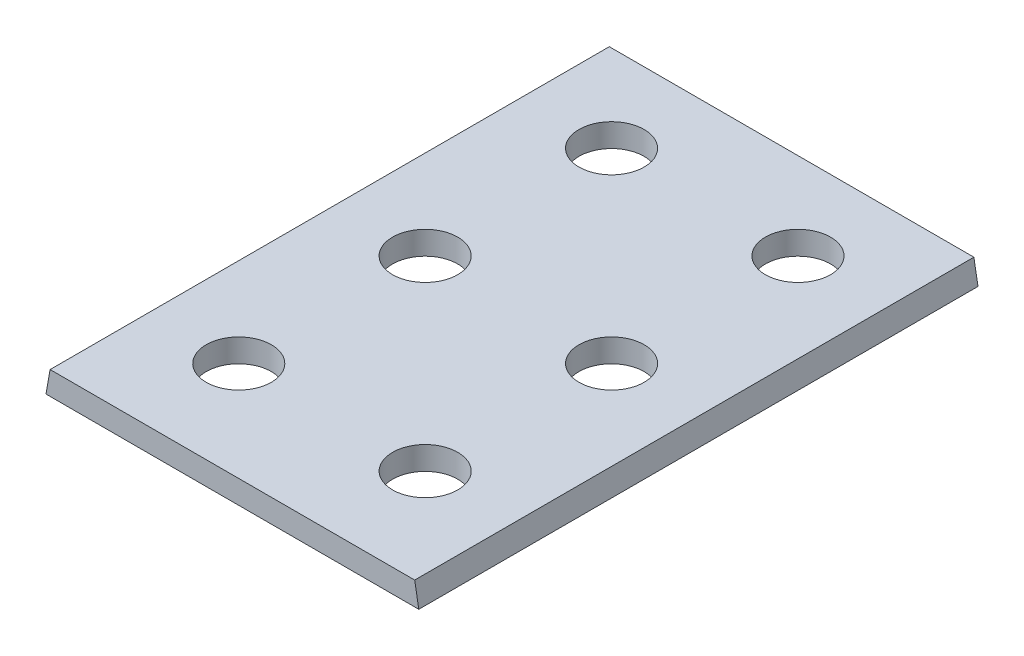
ISO-10303-21;
HEADER;
FILE_DESCRIPTION(('STEP AP214'),'2;1');
FILE_NAME('part.step','',(''),(''),'','','');
FILE_SCHEMA(('AUTOMOTIVE_DESIGN { 1 0 10303 214 1 1 1 1 }'));
ENDSEC;
DATA;
#1=APPLICATION_CONTEXT('core data for automotive mechanical design processes');
#2=APPLICATION_PROTOCOL_DEFINITION('international standard','automotive_design',2000,#1);
#3=PRODUCT_CONTEXT('',#1,'mechanical');
#4=PRODUCT('Part','Part','',(#3));
#5=PRODUCT_RELATED_PRODUCT_CATEGORY('part','',(#4));
#6=PRODUCT_DEFINITION_FORMATION('','',#4);
#7=PRODUCT_DEFINITION_CONTEXT('part definition',#1,'design');
#8=PRODUCT_DEFINITION('design','',#6,#7);
#9=PRODUCT_DEFINITION_SHAPE('','',#8);
#10=(LENGTH_UNIT() NAMED_UNIT(*) SI_UNIT(.MILLI.,.METRE.));
#11=(NAMED_UNIT(*) PLANE_ANGLE_UNIT() SI_UNIT($,.RADIAN.));
#12=(NAMED_UNIT(*) SI_UNIT($,.STERADIAN.) SOLID_ANGLE_UNIT());
#13=UNCERTAINTY_MEASURE_WITH_UNIT(LENGTH_MEASURE(1.E-05),#10,'distance_accuracy_value','');
#14=(GEOMETRIC_REPRESENTATION_CONTEXT(3) GLOBAL_UNCERTAINTY_ASSIGNED_CONTEXT((#13)) GLOBAL_UNIT_ASSIGNED_CONTEXT((#10,
#11,#12)) REPRESENTATION_CONTEXT('',''));
#15=CARTESIAN_POINT('',(0.,0.,0.));
#16=DIRECTION('',(0.,0.,1.));
#17=DIRECTION('',(1.,0.,0.));
#18=AXIS2_PLACEMENT_3D('',#15,#16,#17);
#19=CARTESIAN_POINT('',(0.,6.75,0.));
#20=DIRECTION('',(0.,1.,0.));
#21=DIRECTION('',(0.,0.,1.));
#22=AXIS2_PLACEMENT_3D('',#19,#20,#21);
#23=PLANE('',#22);
#24=CARTESIAN_POINT('',(26.9999999999998,6.75,79.1561495890742));
#25=DIRECTION('',(0.,1.,0.));
#26=DIRECTION('',(0.,0.,1.));
#27=AXIS2_PLACEMENT_3D('',#24,#25,#26);
#28=CIRCLE('',#27,9.43814497246696);
#29=CARTESIAN_POINT('',(26.9999999999998,6.75,88.5942945615411));
#30=VERTEX_POINT('',#29);
#31=EDGE_CURVE('E129',#30,#30,#28,.T.);
#32=ORIENTED_EDGE('',*,*,#31,.F.);
#33=EDGE_LOOP('',(#32));
#34=FACE_BOUND('',#33,.T.);
#35=CARTESIAN_POINT('',(80.9999999999998,6.75,79.1561495890742));
#36=DIRECTION('',(0.,1.,0.));
#37=DIRECTION('',(0.,0.,1.));
#38=AXIS2_PLACEMENT_3D('',#35,#36,#37);
#39=CIRCLE('',#38,9.43814497246697);
#40=CARTESIAN_POINT('',(80.9999999999998,6.75,88.5942945615411));
#41=VERTEX_POINT('',#40);
#42=EDGE_CURVE('E117',#41,#41,#39,.T.);
#43=ORIENTED_EDGE('',*,*,#42,.F.);
#44=EDGE_LOOP('',(#43));
#45=FACE_BOUND('',#44,.T.);
#46=CARTESIAN_POINT('',(27.,6.75,133.156149589074));
#47=DIRECTION('',(0.,1.,0.));
#48=DIRECTION('',(0.,0.,1.));
#49=AXIS2_PLACEMENT_3D('',#46,#47,#48);
#50=CIRCLE('',#49,9.43814497246697);
#51=CARTESIAN_POINT('',(27.,6.75,142.594294561541));
#52=VERTEX_POINT('',#51);
#53=EDGE_CURVE('E105',#52,#52,#50,.T.);
#54=ORIENTED_EDGE('',*,*,#53,.F.);
#55=EDGE_LOOP('',(#54));
#56=FACE_BOUND('',#55,.T.);
#57=CARTESIAN_POINT('',(81.,6.75,133.156149589074));
#58=DIRECTION('',(0.,1.,0.));
#59=DIRECTION('',(0.,0.,1.));
#60=AXIS2_PLACEMENT_3D('',#57,#58,#59);
#61=CIRCLE('',#60,9.43814497246698);
#62=CARTESIAN_POINT('',(81.,6.75,142.594294561541));
#63=VERTEX_POINT('',#62);
#64=EDGE_CURVE('E112',#63,#63,#61,.T.);
#65=ORIENTED_EDGE('',*,*,#64,.F.);
#66=EDGE_LOOP('',(#65));
#67=FACE_BOUND('',#66,.T.);
#68=CARTESIAN_POINT('',(80.9999999999996,6.75,25.1561495890742));
#69=DIRECTION('',(0.,1.,0.));
#70=DIRECTION('',(0.,0.,1.));
#71=AXIS2_PLACEMENT_3D('',#68,#69,#70);
#72=CIRCLE('',#71,9.43814497246697);
#73=CARTESIAN_POINT('',(80.9999999999996,6.75,34.5942945615411));
#74=VERTEX_POINT('',#73);
#75=EDGE_CURVE('E123',#74,#74,#72,.T.);
#76=ORIENTED_EDGE('',*,*,#75,.F.);
#77=EDGE_LOOP('',(#76));
#78=FACE_BOUND('',#77,.T.);
#79=CARTESIAN_POINT('',(26.9999999999996,6.75,25.1561495890742));
#80=DIRECTION('',(0.,1.,0.));
#81=DIRECTION('',(0.,0.,1.));
#82=AXIS2_PLACEMENT_3D('',#79,#80,#81);
#83=CIRCLE('',#82,9.43814497246697);
#84=CARTESIAN_POINT('',(26.9999999999996,6.75,34.5942945615411));
#85=VERTEX_POINT('',#84);
#86=EDGE_CURVE('E135',#85,#85,#83,.T.);
#87=ORIENTED_EDGE('',*,*,#86,.F.);
#88=EDGE_LOOP('',(#87));
#89=FACE_BOUND('',#88,.T.);
#90=DIRECTION('',(-1.,0.,0.));
#91=VECTOR('',#90,1.);
#92=CARTESIAN_POINT('',(0.,6.75,0.));
#93=LINE('',#92,#91);
#94=CARTESIAN_POINT('',(106.809792880218,6.75,0.));
#95=VERTEX_POINT('',#94);
#96=CARTESIAN_POINT('',(1.19020711978211,6.75,0.));
#97=VERTEX_POINT('',#96);
#98=EDGE_CURVE('E98',#95,#97,#93,.T.);
#99=ORIENTED_EDGE('',*,*,#98,.T.);
#100=DIRECTION('',(0.,0.,-1.));
#101=VECTOR('',#100,1.);
#102=CARTESIAN_POINT('',(1.19020711978211,6.75,500.));
#103=LINE('',#102,#101);
#104=CARTESIAN_POINT('',(1.19020711978211,6.75,162.));
#105=VERTEX_POINT('',#104);
#106=EDGE_CURVE('E48',#105,#97,#103,.T.);
#107=ORIENTED_EDGE('',*,*,#106,.F.);
#108=DIRECTION('',(1.,0.,0.));
#109=VECTOR('',#108,1.);
#110=CARTESIAN_POINT('',(0.,6.75,162.));
#111=LINE('',#110,#109);
#112=CARTESIAN_POINT('',(106.809792880218,6.75,162.));
#113=VERTEX_POINT('',#112);
#114=EDGE_CURVE('E95',#105,#113,#111,.T.);
#115=ORIENTED_EDGE('',*,*,#114,.T.);
#116=DIRECTION('',(0.,0.,-1.));
#117=VECTOR('',#116,1.);
#118=CARTESIAN_POINT('',(106.809792880218,6.75,500.));
#119=LINE('',#118,#117);
#120=EDGE_CURVE('E76',#113,#95,#119,.T.);
#121=ORIENTED_EDGE('',*,*,#120,.T.);
#122=EDGE_LOOP('',(#99,#107,#115,#121));
#123=FACE_BOUND('',#122,.T.);
#124=ADVANCED_FACE('F34',(#34,#45,#56,#67,#78,#89,#123),#23,.T.);
#125=CARTESIAN_POINT('',(0.,6.75,162.));
#126=DIRECTION('',(0.,0.,-1.));
#127=DIRECTION('',(-1.,0.,0.));
#128=AXIS2_PLACEMENT_3D('',#125,#126,#127);
#129=PLANE('',#128);
#130=DIRECTION('',(0.173648177666923,0.984807753012209,0.));
#131=VECTOR('',#130,1.);
#132=CARTESIAN_POINT('',(1.15431798372411,6.54646259515246,162.));
#133=LINE('',#132,#131);
#134=CARTESIAN_POINT('',(0.,0.,162.));
#135=VERTEX_POINT('',#134);
#136=EDGE_CURVE('E80',#135,#105,#133,.T.);
#137=ORIENTED_EDGE('',*,*,#136,.F.);
#138=DIRECTION('',(1.,0.,0.));
#139=VECTOR('',#138,1.);
#140=CARTESIAN_POINT('',(0.,0.,162.));
#141=LINE('',#140,#139);
#142=CARTESIAN_POINT('',(108.,0.,162.));
#143=VERTEX_POINT('',#142);
#144=EDGE_CURVE('E84',#135,#143,#141,.T.);
#145=ORIENTED_EDGE('',*,*,#144,.T.);
#146=DIRECTION('',(0.173648177666923,-0.984807753012209,0.));
#147=VECTOR('',#146,1.);
#148=CARTESIAN_POINT('',(103.589083538715,25.0155503347378,162.));
#149=LINE('',#148,#147);
#150=EDGE_CURVE('E72',#113,#143,#149,.T.);
#151=ORIENTED_EDGE('',*,*,#150,.F.);
#152=ORIENTED_EDGE('',*,*,#114,.F.);
#153=EDGE_LOOP('',(#137,#145,#151,#152));
#154=FACE_BOUND('',#153,.T.);
#155=ADVANCED_FACE('F36',(#154),#129,.F.);
#156=CARTESIAN_POINT('',(0.,6.75,0.));
#157=DIRECTION('',(0.,0.,1.));
#158=DIRECTION('',(1.,0.,0.));
#159=AXIS2_PLACEMENT_3D('',#156,#157,#158);
#160=PLANE('',#159);
#161=DIRECTION('',(-0.173648177666923,-0.984807753012209,0.));
#162=VECTOR('',#161,1.);
#163=CARTESIAN_POINT('',(1.15431798372411,6.54646259515245,0.));
#164=LINE('',#163,#162);
#165=CARTESIAN_POINT('',(0.,0.,0.));
#166=VERTEX_POINT('',#165);
#167=EDGE_CURVE('E11',#97,#166,#164,.T.);
#168=ORIENTED_EDGE('',*,*,#167,.F.);
#169=ORIENTED_EDGE('',*,*,#98,.F.);
#170=DIRECTION('',(-0.173648177666923,0.984807753012209,0.));
#171=VECTOR('',#170,1.);
#172=CARTESIAN_POINT('',(103.589083538715,25.0155503347378,0.));
#173=LINE('',#172,#171);
#174=CARTESIAN_POINT('',(108.,0.,0.));
#175=VERTEX_POINT('',#174);
#176=EDGE_CURVE('E42',#175,#95,#173,.T.);
#177=ORIENTED_EDGE('',*,*,#176,.F.);
#178=DIRECTION('',(-1.,0.,0.));
#179=VECTOR('',#178,1.);
#180=CARTESIAN_POINT('',(0.,0.,0.));
#181=LINE('',#180,#179);
#182=EDGE_CURVE('E93',#175,#166,#181,.T.);
#183=ORIENTED_EDGE('',*,*,#182,.T.);
#184=EDGE_LOOP('',(#168,#169,#177,#183));
#185=FACE_BOUND('',#184,.T.);
#186=ADVANCED_FACE('F146',(#185),#160,.F.);
#187=CARTESIAN_POINT('',(0.,0.,0.));
#188=DIRECTION('',(0.,1.,0.));
#189=DIRECTION('',(0.,0.,1.));
#190=AXIS2_PLACEMENT_3D('',#187,#188,#189);
#191=PLANE('',#190);
#192=DIRECTION('',(0.,0.,1.));
#193=VECTOR('',#192,1.);
#194=CARTESIAN_POINT('',(0.,0.,0.));
#195=LINE('',#194,#193);
#196=EDGE_CURVE('E87',#166,#135,#195,.T.);
#197=ORIENTED_EDGE('',*,*,#196,.F.);
#198=ORIENTED_EDGE('',*,*,#182,.F.);
#199=DIRECTION('',(0.,0.,-1.));
#200=VECTOR('',#199,1.);
#201=CARTESIAN_POINT('',(108.,0.,0.));
#202=LINE('',#201,#200);
#203=EDGE_CURVE('E56',#143,#175,#202,.T.);
#204=ORIENTED_EDGE('',*,*,#203,.F.);
#205=ORIENTED_EDGE('',*,*,#144,.F.);
#206=EDGE_LOOP('',(#197,#198,#204,#205));
#207=FACE_BOUND('',#206,.T.);
#208=CARTESIAN_POINT('',(27.,0.,133.156149589074));
#209=DIRECTION('',(0.,1.,0.));
#210=DIRECTION('',(0.,0.,1.));
#211=AXIS2_PLACEMENT_3D('',#208,#209,#210);
#212=CIRCLE('',#211,9.43814497246697);
#213=CARTESIAN_POINT('',(27.,0.,142.594294561541));
#214=VERTEX_POINT('',#213);
#215=EDGE_CURVE('E107',#214,#214,#212,.T.);
#216=ORIENTED_EDGE('',*,*,#215,.T.);
#217=EDGE_LOOP('',(#216));
#218=FACE_BOUND('',#217,.T.);
#219=CARTESIAN_POINT('',(81.,0.,133.156149589074));
#220=DIRECTION('',(0.,1.,0.));
#221=DIRECTION('',(0.,0.,1.));
#222=AXIS2_PLACEMENT_3D('',#219,#220,#221);
#223=CIRCLE('',#222,9.43814497246698);
#224=CARTESIAN_POINT('',(81.,0.,142.594294561541));
#225=VERTEX_POINT('',#224);
#226=EDGE_CURVE('E114',#225,#225,#223,.T.);
#227=ORIENTED_EDGE('',*,*,#226,.T.);
#228=EDGE_LOOP('',(#227));
#229=FACE_BOUND('',#228,.T.);
#230=CARTESIAN_POINT('',(80.9999999999998,0.,79.1561495890742));
#231=DIRECTION('',(0.,1.,0.));
#232=DIRECTION('',(0.,0.,1.));
#233=AXIS2_PLACEMENT_3D('',#230,#231,#232);
#234=CIRCLE('',#233,9.43814497246697);
#235=CARTESIAN_POINT('',(80.9999999999998,0.,88.5942945615411));
#236=VERTEX_POINT('',#235);
#237=EDGE_CURVE('E120',#236,#236,#234,.T.);
#238=ORIENTED_EDGE('',*,*,#237,.T.);
#239=EDGE_LOOP('',(#238));
#240=FACE_BOUND('',#239,.T.);
#241=CARTESIAN_POINT('',(80.9999999999996,0.,25.1561495890742));
#242=DIRECTION('',(0.,1.,0.));
#243=DIRECTION('',(0.,0.,1.));
#244=AXIS2_PLACEMENT_3D('',#241,#242,#243);
#245=CIRCLE('',#244,9.43814497246697);
#246=CARTESIAN_POINT('',(80.9999999999996,0.,34.5942945615411));
#247=VERTEX_POINT('',#246);
#248=EDGE_CURVE('E126',#247,#247,#245,.T.);
#249=ORIENTED_EDGE('',*,*,#248,.T.);
#250=EDGE_LOOP('',(#249));
#251=FACE_BOUND('',#250,.T.);
#252=CARTESIAN_POINT('',(26.9999999999998,0.,79.1561495890742));
#253=DIRECTION('',(0.,1.,0.));
#254=DIRECTION('',(0.,0.,1.));
#255=AXIS2_PLACEMENT_3D('',#252,#253,#254);
#256=CIRCLE('',#255,9.43814497246696);
#257=CARTESIAN_POINT('',(26.9999999999998,0.,88.5942945615411));
#258=VERTEX_POINT('',#257);
#259=EDGE_CURVE('E132',#258,#258,#256,.T.);
#260=ORIENTED_EDGE('',*,*,#259,.T.);
#261=EDGE_LOOP('',(#260));
#262=FACE_BOUND('',#261,.T.);
#263=CARTESIAN_POINT('',(26.9999999999996,0.,25.1561495890742));
#264=DIRECTION('',(0.,1.,0.));
#265=DIRECTION('',(0.,0.,1.));
#266=AXIS2_PLACEMENT_3D('',#263,#264,#265);
#267=CIRCLE('',#266,9.43814497246697);
#268=CARTESIAN_POINT('',(26.9999999999996,0.,34.5942945615411));
#269=VERTEX_POINT('',#268);
#270=EDGE_CURVE('E138',#269,#269,#267,.T.);
#271=ORIENTED_EDGE('',*,*,#270,.T.);
#272=EDGE_LOOP('',(#271));
#273=FACE_BOUND('',#272,.T.);
#274=ADVANCED_FACE('F90',(#207,#218,#229,#240,#251,#262,#273),#191,.F.);
#275=CARTESIAN_POINT('',(27.,6.75,133.156149589074));
#276=DIRECTION('',(0.,-1.,0.));
#277=DIRECTION('',(0.,0.,-1.));
#278=AXIS2_PLACEMENT_3D('',#275,#276,#277);
#279=CYLINDRICAL_SURFACE('',#278,9.43814497246697);
#280=ORIENTED_EDGE('',*,*,#53,.T.);
#281=EDGE_LOOP('',(#280));
#282=FACE_BOUND('',#281,.T.);
#283=ORIENTED_EDGE('',*,*,#215,.F.);
#284=EDGE_LOOP('',(#283));
#285=FACE_BOUND('',#284,.T.);
#286=ADVANCED_FACE('F165',(#282,#285),#279,.F.);
#287=CARTESIAN_POINT('',(81.,6.75,133.156149589074));
#288=DIRECTION('',(0.,-1.,0.));
#289=DIRECTION('',(0.,0.,-1.));
#290=AXIS2_PLACEMENT_3D('',#287,#288,#289);
#291=CYLINDRICAL_SURFACE('',#290,9.43814497246698);
#292=ORIENTED_EDGE('',*,*,#64,.T.);
#293=EDGE_LOOP('',(#292));
#294=FACE_BOUND('',#293,.T.);
#295=ORIENTED_EDGE('',*,*,#226,.F.);
#296=EDGE_LOOP('',(#295));
#297=FACE_BOUND('',#296,.T.);
#298=ADVANCED_FACE('F184',(#294,#297),#291,.F.);
#299=CARTESIAN_POINT('',(80.9999999999998,6.75,79.1561495890742));
#300=DIRECTION('',(0.,-1.,0.));
#301=DIRECTION('',(0.,0.,-1.));
#302=AXIS2_PLACEMENT_3D('',#299,#300,#301);
#303=CYLINDRICAL_SURFACE('',#302,9.43814497246697);
#304=ORIENTED_EDGE('',*,*,#42,.T.);
#305=EDGE_LOOP('',(#304));
#306=FACE_BOUND('',#305,.T.);
#307=ORIENTED_EDGE('',*,*,#237,.F.);
#308=EDGE_LOOP('',(#307));
#309=FACE_BOUND('',#308,.T.);
#310=ADVANCED_FACE('F190',(#306,#309),#303,.F.);
#311=CARTESIAN_POINT('',(80.9999999999996,6.75,25.1561495890742));
#312=DIRECTION('',(0.,-1.,0.));
#313=DIRECTION('',(0.,0.,-1.));
#314=AXIS2_PLACEMENT_3D('',#311,#312,#313);
#315=CYLINDRICAL_SURFACE('',#314,9.43814497246697);
#316=ORIENTED_EDGE('',*,*,#75,.T.);
#317=EDGE_LOOP('',(#316));
#318=FACE_BOUND('',#317,.T.);
#319=ORIENTED_EDGE('',*,*,#248,.F.);
#320=EDGE_LOOP('',(#319));
#321=FACE_BOUND('',#320,.T.);
#322=ADVANCED_FACE('F197',(#318,#321),#315,.F.);
#323=CARTESIAN_POINT('',(26.9999999999998,6.75,79.1561495890742));
#324=DIRECTION('',(0.,-1.,0.));
#325=DIRECTION('',(0.,0.,-1.));
#326=AXIS2_PLACEMENT_3D('',#323,#324,#325);
#327=CYLINDRICAL_SURFACE('',#326,9.43814497246696);
#328=ORIENTED_EDGE('',*,*,#31,.T.);
#329=EDGE_LOOP('',(#328));
#330=FACE_BOUND('',#329,.T.);
#331=ORIENTED_EDGE('',*,*,#259,.F.);
#332=EDGE_LOOP('',(#331));
#333=FACE_BOUND('',#332,.T.);
#334=ADVANCED_FACE('F205',(#330,#333),#327,.F.);
#335=CARTESIAN_POINT('',(26.9999999999996,6.75,25.1561495890742));
#336=DIRECTION('',(0.,-1.,0.));
#337=DIRECTION('',(0.,0.,-1.));
#338=AXIS2_PLACEMENT_3D('',#335,#336,#337);
#339=CYLINDRICAL_SURFACE('',#338,9.43814497246697);
#340=ORIENTED_EDGE('',*,*,#86,.T.);
#341=EDGE_LOOP('',(#340));
#342=FACE_BOUND('',#341,.T.);
#343=ORIENTED_EDGE('',*,*,#270,.F.);
#344=EDGE_LOOP('',(#343));
#345=FACE_BOUND('',#344,.T.);
#346=ADVANCED_FACE('F153',(#342,#345),#339,.F.);
#347=CARTESIAN_POINT('',(108.,0.,500.));
#348=DIRECTION('',(0.984807753012209,0.173648177666923,0.));
#349=DIRECTION('',(-0.173648177666923,0.984807753012209,0.));
#350=AXIS2_PLACEMENT_3D('',#347,#348,#349);
#351=PLANE('',#350);
#352=ORIENTED_EDGE('',*,*,#150,.T.);
#353=ORIENTED_EDGE('',*,*,#203,.T.);
#354=ORIENTED_EDGE('',*,*,#176,.T.);
#355=ORIENTED_EDGE('',*,*,#120,.F.);
#356=EDGE_LOOP('',(#352,#353,#354,#355));
#357=FACE_BOUND('',#356,.T.);
#358=ADVANCED_FACE('F74',(#357),#351,.T.);
#359=CARTESIAN_POINT('',(0.,0.,500.));
#360=DIRECTION('',(-0.984807753012209,0.173648177666923,0.));
#361=DIRECTION('',(-0.173648177666923,-0.984807753012209,0.));
#362=AXIS2_PLACEMENT_3D('',#359,#360,#361);
#363=PLANE('',#362);
#364=ORIENTED_EDGE('',*,*,#136,.T.);
#365=ORIENTED_EDGE('',*,*,#106,.T.);
#366=ORIENTED_EDGE('',*,*,#167,.T.);
#367=ORIENTED_EDGE('',*,*,#196,.T.);
#368=EDGE_LOOP('',(#364,#365,#366,#367));
#369=FACE_BOUND('',#368,.T.);
#370=ADVANCED_FACE('F147',(#369),#363,.T.);
#371=CLOSED_SHELL('',(#124,#155,#186,#274,#286,#298,#310,#322,#334,#346,#358,#370));
#372=MANIFOLD_SOLID_BREP('B2',#371);
#373=ADVANCED_BREP_SHAPE_REPRESENTATION('',(#18,#372),#14);
#374=SHAPE_DEFINITION_REPRESENTATION(#9,#373);
ENDSEC;
END-ISO-10303-21;
